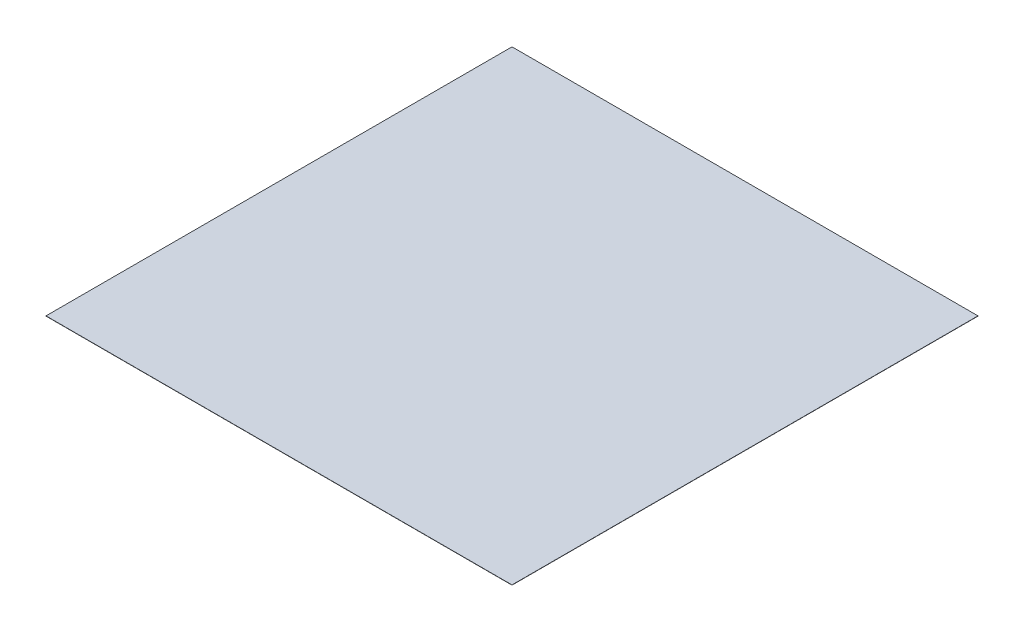
ISO-10303-21;
HEADER;
FILE_DESCRIPTION(('STEP AP214'),'2;1');
FILE_NAME('part.step','',(''),(''),'','','');
FILE_SCHEMA(('AUTOMOTIVE_DESIGN { 1 0 10303 214 1 1 1 1 }'));
ENDSEC;
DATA;
#1=APPLICATION_CONTEXT('core data for automotive mechanical design processes');
#2=APPLICATION_PROTOCOL_DEFINITION('international standard','automotive_design',2000,#1);
#3=PRODUCT_CONTEXT('',#1,'mechanical');
#4=PRODUCT('Part','Part','',(#3));
#5=PRODUCT_RELATED_PRODUCT_CATEGORY('part','',(#4));
#6=PRODUCT_DEFINITION_FORMATION('','',#4);
#7=PRODUCT_DEFINITION_CONTEXT('part definition',#1,'design');
#8=PRODUCT_DEFINITION('design','',#6,#7);
#9=PRODUCT_DEFINITION_SHAPE('','',#8);
#10=(LENGTH_UNIT() NAMED_UNIT(*) SI_UNIT(.MILLI.,.METRE.));
#11=(NAMED_UNIT(*) PLANE_ANGLE_UNIT() SI_UNIT($,.RADIAN.));
#12=(NAMED_UNIT(*) SI_UNIT($,.STERADIAN.) SOLID_ANGLE_UNIT());
#13=UNCERTAINTY_MEASURE_WITH_UNIT(LENGTH_MEASURE(1.E-05),#10,'distance_accuracy_value','');
#14=(GEOMETRIC_REPRESENTATION_CONTEXT(3) GLOBAL_UNCERTAINTY_ASSIGNED_CONTEXT((#13)) GLOBAL_UNIT_ASSIGNED_CONTEXT((#10,
#11,#12)) REPRESENTATION_CONTEXT('',''));
#15=CARTESIAN_POINT('',(0.,0.,0.));
#16=DIRECTION('',(0.,0.,1.));
#17=DIRECTION('',(1.,0.,0.));
#18=AXIS2_PLACEMENT_3D('',#15,#16,#17);
#19=CARTESIAN_POINT('',(2000.,2.,2000.));
#20=DIRECTION('',(-1.,0.,0.));
#21=DIRECTION('',(0.,0.,1.));
#22=AXIS2_PLACEMENT_3D('',#19,#20,#21);
#23=PLANE('',#22);
#24=DIRECTION('',(0.,0.,-1.));
#25=VECTOR('',#24,1.);
#26=CARTESIAN_POINT('',(2000.,0.,2000.));
#27=LINE('',#26,#25);
#28=CARTESIAN_POINT('',(2000.,0.,2000.));
#29=VERTEX_POINT('',#28);
#30=CARTESIAN_POINT('',(2000.,0.,-2000.));
#31=VERTEX_POINT('',#30);
#32=EDGE_CURVE('E96',#29,#31,#27,.T.);
#33=ORIENTED_EDGE('',*,*,#32,.T.);
#34=DIRECTION('',(0.,-1.,0.));
#35=VECTOR('',#34,1.);
#36=CARTESIAN_POINT('',(2000.,2.,-2000.));
#37=LINE('',#36,#35);
#38=CARTESIAN_POINT('',(2000.,2.,-2000.));
#39=VERTEX_POINT('',#38);
#40=EDGE_CURVE('E11',#39,#31,#37,.T.);
#41=ORIENTED_EDGE('',*,*,#40,.F.);
#42=DIRECTION('',(0.,0.,-1.));
#43=VECTOR('',#42,1.);
#44=CARTESIAN_POINT('',(2000.,2.,2000.));
#45=LINE('',#44,#43);
#46=CARTESIAN_POINT('',(2000.,2.,2000.));
#47=VERTEX_POINT('',#46);
#48=EDGE_CURVE('E84',#47,#39,#45,.T.);
#49=ORIENTED_EDGE('',*,*,#48,.F.);
#50=DIRECTION('',(0.,-1.,0.));
#51=VECTOR('',#50,1.);
#52=CARTESIAN_POINT('',(2000.,2.,2000.));
#53=LINE('',#52,#51);
#54=EDGE_CURVE('E92',#47,#29,#53,.T.);
#55=ORIENTED_EDGE('',*,*,#54,.T.);
#56=EDGE_LOOP('',(#33,#41,#49,#55));
#57=FACE_BOUND('',#56,.T.);
#58=ADVANCED_FACE('F33',(#57),#23,.F.);
#59=CARTESIAN_POINT('',(-2000.,2.,-2000.));
#60=DIRECTION('',(0.,0.,1.));
#61=DIRECTION('',(1.,0.,0.));
#62=AXIS2_PLACEMENT_3D('',#59,#60,#61);
#63=PLANE('',#62);
#64=DIRECTION('',(-1.,0.,0.));
#65=VECTOR('',#64,1.);
#66=CARTESIAN_POINT('',(-2000.,0.,-2000.));
#67=LINE('',#66,#65);
#68=CARTESIAN_POINT('',(-2000.,0.,-2000.));
#69=VERTEX_POINT('',#68);
#70=EDGE_CURVE('E88',#31,#69,#67,.T.);
#71=ORIENTED_EDGE('',*,*,#70,.T.);
#72=DIRECTION('',(0.,-1.,0.));
#73=VECTOR('',#72,1.);
#74=CARTESIAN_POINT('',(-2000.,2.,-2000.));
#75=LINE('',#74,#73);
#76=CARTESIAN_POINT('',(-2000.,2.,-2000.));
#77=VERTEX_POINT('',#76);
#78=EDGE_CURVE('E41',#77,#69,#75,.T.);
#79=ORIENTED_EDGE('',*,*,#78,.F.);
#80=DIRECTION('',(-1.,0.,0.));
#81=VECTOR('',#80,1.);
#82=CARTESIAN_POINT('',(-2000.,2.,-2000.));
#83=LINE('',#82,#81);
#84=EDGE_CURVE('E79',#39,#77,#83,.T.);
#85=ORIENTED_EDGE('',*,*,#84,.F.);
#86=ORIENTED_EDGE('',*,*,#40,.T.);
#87=EDGE_LOOP('',(#71,#79,#85,#86));
#88=FACE_BOUND('',#87,.T.);
#89=ADVANCED_FACE('F87',(#88),#63,.F.);
#90=CARTESIAN_POINT('',(-2000.,2.,2000.));
#91=DIRECTION('',(1.,0.,0.));
#92=DIRECTION('',(0.,0.,-1.));
#93=AXIS2_PLACEMENT_3D('',#90,#91,#92);
#94=PLANE('',#93);
#95=DIRECTION('',(0.,0.,1.));
#96=VECTOR('',#95,1.);
#97=CARTESIAN_POINT('',(-2000.,0.,2000.));
#98=LINE('',#97,#96);
#99=CARTESIAN_POINT('',(-2000.,0.,2000.));
#100=VERTEX_POINT('',#99);
#101=EDGE_CURVE('E66',#69,#100,#98,.T.);
#102=ORIENTED_EDGE('',*,*,#101,.T.);
#103=DIRECTION('',(0.,-1.,0.));
#104=VECTOR('',#103,1.);
#105=CARTESIAN_POINT('',(-2000.,2.,2000.));
#106=LINE('',#105,#104);
#107=CARTESIAN_POINT('',(-2000.,2.,2000.));
#108=VERTEX_POINT('',#107);
#109=EDGE_CURVE('E89',#108,#100,#106,.T.);
#110=ORIENTED_EDGE('',*,*,#109,.F.);
#111=DIRECTION('',(0.,0.,1.));
#112=VECTOR('',#111,1.);
#113=CARTESIAN_POINT('',(-2000.,2.,2000.));
#114=LINE('',#113,#112);
#115=EDGE_CURVE('E82',#77,#108,#114,.T.);
#116=ORIENTED_EDGE('',*,*,#115,.F.);
#117=ORIENTED_EDGE('',*,*,#78,.T.);
#118=EDGE_LOOP('',(#102,#110,#116,#117));
#119=FACE_BOUND('',#118,.T.);
#120=ADVANCED_FACE('F90',(#119),#94,.F.);
#121=CARTESIAN_POINT('',(-2000.,2.,2000.));
#122=DIRECTION('',(0.,0.,-1.));
#123=DIRECTION('',(-1.,0.,0.));
#124=AXIS2_PLACEMENT_3D('',#121,#122,#123);
#125=PLANE('',#124);
#126=DIRECTION('',(1.,0.,0.));
#127=VECTOR('',#126,1.);
#128=CARTESIAN_POINT('',(-2000.,0.,2000.));
#129=LINE('',#128,#127);
#130=EDGE_CURVE('E72',#100,#29,#129,.T.);
#131=ORIENTED_EDGE('',*,*,#130,.T.);
#132=ORIENTED_EDGE('',*,*,#54,.F.);
#133=DIRECTION('',(1.,0.,0.));
#134=VECTOR('',#133,1.);
#135=CARTESIAN_POINT('',(-2000.,2.,2000.));
#136=LINE('',#135,#134);
#137=EDGE_CURVE('E49',#108,#47,#136,.T.);
#138=ORIENTED_EDGE('',*,*,#137,.F.);
#139=ORIENTED_EDGE('',*,*,#109,.T.);
#140=EDGE_LOOP('',(#131,#132,#138,#139));
#141=FACE_BOUND('',#140,.T.);
#142=ADVANCED_FACE('F103',(#141),#125,.F.);
#143=CARTESIAN_POINT('',(0.,2.,0.));
#144=DIRECTION('',(0.,-1.,0.));
#145=DIRECTION('',(0.,0.,-1.));
#146=AXIS2_PLACEMENT_3D('',#143,#144,#145);
#147=PLANE('',#146);
#148=ORIENTED_EDGE('',*,*,#48,.T.);
#149=ORIENTED_EDGE('',*,*,#84,.T.);
#150=ORIENTED_EDGE('',*,*,#115,.T.);
#151=ORIENTED_EDGE('',*,*,#137,.T.);
#152=EDGE_LOOP('',(#148,#149,#150,#151));
#153=FACE_BOUND('',#152,.T.);
#154=ADVANCED_FACE('F80',(#153),#147,.F.);
#155=CARTESIAN_POINT('',(0.,0.,0.));
#156=DIRECTION('',(0.,-1.,0.));
#157=DIRECTION('',(0.,0.,-1.));
#158=AXIS2_PLACEMENT_3D('',#155,#156,#157);
#159=PLANE('',#158);
#160=ORIENTED_EDGE('',*,*,#32,.F.);
#161=ORIENTED_EDGE('',*,*,#130,.F.);
#162=ORIENTED_EDGE('',*,*,#101,.F.);
#163=ORIENTED_EDGE('',*,*,#70,.F.);
#164=EDGE_LOOP('',(#160,#161,#162,#163));
#165=FACE_BOUND('',#164,.T.);
#166=ADVANCED_FACE('F106',(#165),#159,.T.);
#167=CLOSED_SHELL('',(#58,#89,#120,#142,#154,#166));
#168=MANIFOLD_SOLID_BREP('B2',#167);
#169=ADVANCED_BREP_SHAPE_REPRESENTATION('',(#18,#168),#14);
#170=SHAPE_DEFINITION_REPRESENTATION(#9,#169);
ENDSEC;
END-ISO-10303-21;
